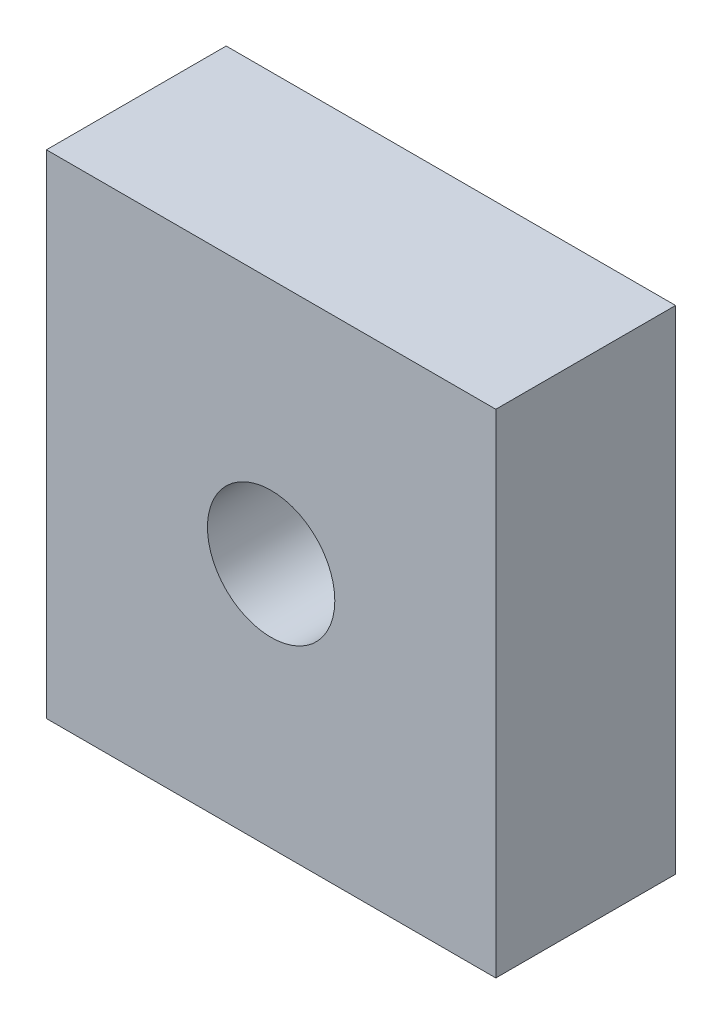
ISO-10303-21;
HEADER;
FILE_DESCRIPTION(('STEP AP214'),'2;1');
FILE_NAME('part.step','',(''),(''),'','','');
FILE_SCHEMA(('AUTOMOTIVE_DESIGN { 1 0 10303 214 1 1 1 1 }'));
ENDSEC;
DATA;
#1=APPLICATION_CONTEXT('core data for automotive mechanical design processes');
#2=APPLICATION_PROTOCOL_DEFINITION('international standard','automotive_design',2000,#1);
#3=PRODUCT_CONTEXT('',#1,'mechanical');
#4=PRODUCT('Part','Part','',(#3));
#5=PRODUCT_RELATED_PRODUCT_CATEGORY('part','',(#4));
#6=PRODUCT_DEFINITION_FORMATION('','',#4);
#7=PRODUCT_DEFINITION_CONTEXT('part definition',#1,'design');
#8=PRODUCT_DEFINITION('design','',#6,#7);
#9=PRODUCT_DEFINITION_SHAPE('','',#8);
#10=(LENGTH_UNIT() NAMED_UNIT(*) SI_UNIT(.MILLI.,.METRE.));
#11=(NAMED_UNIT(*) PLANE_ANGLE_UNIT() SI_UNIT($,.RADIAN.));
#12=(NAMED_UNIT(*) SI_UNIT($,.STERADIAN.) SOLID_ANGLE_UNIT());
#13=UNCERTAINTY_MEASURE_WITH_UNIT(LENGTH_MEASURE(1.E-05),#10,'distance_accuracy_value','');
#14=(GEOMETRIC_REPRESENTATION_CONTEXT(3) GLOBAL_UNCERTAINTY_ASSIGNED_CONTEXT((#13)) GLOBAL_UNIT_ASSIGNED_CONTEXT((#10,
#11,#12)) REPRESENTATION_CONTEXT('',''));
#15=CARTESIAN_POINT('',(0.,0.,0.));
#16=DIRECTION('',(0.,0.,1.));
#17=DIRECTION('',(1.,0.,0.));
#18=AXIS2_PLACEMENT_3D('',#15,#16,#17);
#19=CARTESIAN_POINT('',(0.,0.,6.35));
#20=DIRECTION('',(-1.,0.,0.));
#21=DIRECTION('',(0.,-1.,0.));
#22=AXIS2_PLACEMENT_3D('',#19,#20,#21);
#23=PLANE('',#22);
#24=DIRECTION('',(0.,1.,0.));
#25=VECTOR('',#24,1.);
#26=CARTESIAN_POINT('',(0.,0.,0.));
#27=LINE('',#26,#25);
#28=CARTESIAN_POINT('',(0.,0.,0.));
#29=VERTEX_POINT('',#28);
#30=CARTESIAN_POINT('',(0.,17.4,0.));
#31=VERTEX_POINT('',#30);
#32=EDGE_CURVE('E95',#29,#31,#27,.T.);
#33=ORIENTED_EDGE('',*,*,#32,.T.);
#34=DIRECTION('',(0.,0.,-1.));
#35=VECTOR('',#34,1.);
#36=CARTESIAN_POINT('',(0.,17.4,6.35));
#37=LINE('',#36,#35);
#38=CARTESIAN_POINT('',(0.,17.4,6.35));
#39=VERTEX_POINT('',#38);
#40=EDGE_CURVE('E11',#39,#31,#37,.T.);
#41=ORIENTED_EDGE('',*,*,#40,.F.);
#42=DIRECTION('',(0.,1.,0.));
#43=VECTOR('',#42,1.);
#44=CARTESIAN_POINT('',(0.,0.,6.35));
#45=LINE('',#44,#43);
#46=CARTESIAN_POINT('',(0.,0.,6.35));
#47=VERTEX_POINT('',#46);
#48=EDGE_CURVE('E83',#47,#39,#45,.T.);
#49=ORIENTED_EDGE('',*,*,#48,.F.);
#50=DIRECTION('',(0.,0.,-1.));
#51=VECTOR('',#50,1.);
#52=CARTESIAN_POINT('',(0.,0.,6.35));
#53=LINE('',#52,#51);
#54=EDGE_CURVE('E91',#47,#29,#53,.T.);
#55=ORIENTED_EDGE('',*,*,#54,.T.);
#56=EDGE_LOOP('',(#33,#41,#49,#55));
#57=FACE_BOUND('',#56,.T.);
#58=ADVANCED_FACE('F32',(#57),#23,.F.);
#59=CARTESIAN_POINT('',(0.,17.4,6.35));
#60=DIRECTION('',(0.,-1.,0.));
#61=DIRECTION('',(1.,0.,0.));
#62=AXIS2_PLACEMENT_3D('',#59,#60,#61);
#63=PLANE('',#62);
#64=DIRECTION('',(-1.,0.,0.));
#65=VECTOR('',#64,1.);
#66=CARTESIAN_POINT('',(0.,17.4,0.));
#67=LINE('',#66,#65);
#68=CARTESIAN_POINT('',(-15.875,17.4,0.));
#69=VERTEX_POINT('',#68);
#70=EDGE_CURVE('E87',#31,#69,#67,.T.);
#71=ORIENTED_EDGE('',*,*,#70,.T.);
#72=DIRECTION('',(0.,0.,-1.));
#73=VECTOR('',#72,1.);
#74=CARTESIAN_POINT('',(-15.875,17.4,6.35));
#75=LINE('',#74,#73);
#76=CARTESIAN_POINT('',(-15.875,17.4,6.35));
#77=VERTEX_POINT('',#76);
#78=EDGE_CURVE('E40',#77,#69,#75,.T.);
#79=ORIENTED_EDGE('',*,*,#78,.F.);
#80=DIRECTION('',(-1.,0.,0.));
#81=VECTOR('',#80,1.);
#82=CARTESIAN_POINT('',(0.,17.4,6.35));
#83=LINE('',#82,#81);
#84=EDGE_CURVE('E78',#39,#77,#83,.T.);
#85=ORIENTED_EDGE('',*,*,#84,.F.);
#86=ORIENTED_EDGE('',*,*,#40,.T.);
#87=EDGE_LOOP('',(#71,#79,#85,#86));
#88=FACE_BOUND('',#87,.T.);
#89=ADVANCED_FACE('F86',(#88),#63,.F.);
#90=CARTESIAN_POINT('',(-15.875,0.,6.35));
#91=DIRECTION('',(1.,0.,0.));
#92=DIRECTION('',(0.,0.,-1.));
#93=AXIS2_PLACEMENT_3D('',#90,#91,#92);
#94=PLANE('',#93);
#95=DIRECTION('',(0.,-1.,0.));
#96=VECTOR('',#95,1.);
#97=CARTESIAN_POINT('',(-15.875,0.,0.));
#98=LINE('',#97,#96);
#99=CARTESIAN_POINT('',(-15.875,0.,0.));
#100=VERTEX_POINT('',#99);
#101=EDGE_CURVE('E65',#69,#100,#98,.T.);
#102=ORIENTED_EDGE('',*,*,#101,.T.);
#103=DIRECTION('',(0.,0.,-1.));
#104=VECTOR('',#103,1.);
#105=CARTESIAN_POINT('',(-15.875,0.,6.35));
#106=LINE('',#105,#104);
#107=CARTESIAN_POINT('',(-15.875,0.,6.35));
#108=VERTEX_POINT('',#107);
#109=EDGE_CURVE('E88',#108,#100,#106,.T.);
#110=ORIENTED_EDGE('',*,*,#109,.F.);
#111=DIRECTION('',(0.,-1.,0.));
#112=VECTOR('',#111,1.);
#113=CARTESIAN_POINT('',(-15.875,0.,6.35));
#114=LINE('',#113,#112);
#115=EDGE_CURVE('E81',#77,#108,#114,.T.);
#116=ORIENTED_EDGE('',*,*,#115,.F.);
#117=ORIENTED_EDGE('',*,*,#78,.T.);
#118=EDGE_LOOP('',(#102,#110,#116,#117));
#119=FACE_BOUND('',#118,.T.);
#120=ADVANCED_FACE('F89',(#119),#94,.F.);
#121=CARTESIAN_POINT('',(0.,0.,6.35));
#122=DIRECTION('',(0.,1.,0.));
#123=DIRECTION('',(-1.,0.,0.));
#124=AXIS2_PLACEMENT_3D('',#121,#122,#123);
#125=PLANE('',#124);
#126=DIRECTION('',(1.,0.,0.));
#127=VECTOR('',#126,1.);
#128=CARTESIAN_POINT('',(0.,0.,0.));
#129=LINE('',#128,#127);
#130=EDGE_CURVE('E71',#100,#29,#129,.T.);
#131=ORIENTED_EDGE('',*,*,#130,.T.);
#132=ORIENTED_EDGE('',*,*,#54,.F.);
#133=DIRECTION('',(1.,0.,0.));
#134=VECTOR('',#133,1.);
#135=CARTESIAN_POINT('',(0.,0.,6.35));
#136=LINE('',#135,#134);
#137=EDGE_CURVE('E48',#108,#47,#136,.T.);
#138=ORIENTED_EDGE('',*,*,#137,.F.);
#139=ORIENTED_EDGE('',*,*,#109,.T.);
#140=EDGE_LOOP('',(#131,#132,#138,#139));
#141=FACE_BOUND('',#140,.T.);
#142=ADVANCED_FACE('F103',(#141),#125,.F.);
#143=CARTESIAN_POINT('',(0.,17.4,6.35));
#144=DIRECTION('',(0.,0.,1.));
#145=DIRECTION('',(1.,0.,0.));
#146=AXIS2_PLACEMENT_3D('',#143,#144,#145);
#147=PLANE('',#146);
#148=CARTESIAN_POINT('',(-7.9375,8.7,6.35));
#149=DIRECTION('',(0.,0.,1.));
#150=DIRECTION('',(1.,0.,0.));
#151=AXIS2_PLACEMENT_3D('',#148,#149,#150);
#152=CIRCLE('',#151,2.24999999999999);
#153=CARTESIAN_POINT('',(-5.68750000000001,8.7,6.35));
#154=VERTEX_POINT('',#153);
#155=EDGE_CURVE('E111',#154,#154,#152,.T.);
#156=ORIENTED_EDGE('',*,*,#155,.F.);
#157=EDGE_LOOP('',(#156));
#158=FACE_BOUND('',#157,.T.);
#159=ORIENTED_EDGE('',*,*,#48,.T.);
#160=ORIENTED_EDGE('',*,*,#84,.T.);
#161=ORIENTED_EDGE('',*,*,#115,.T.);
#162=ORIENTED_EDGE('',*,*,#137,.T.);
#163=EDGE_LOOP('',(#159,#160,#161,#162));
#164=FACE_BOUND('',#163,.T.);
#165=ADVANCED_FACE('F79',(#158,#164),#147,.T.);
#166=CARTESIAN_POINT('',(0.,17.4,0.));
#167=DIRECTION('',(0.,0.,1.));
#168=DIRECTION('',(1.,0.,0.));
#169=AXIS2_PLACEMENT_3D('',#166,#167,#168);
#170=PLANE('',#169);
#171=CARTESIAN_POINT('',(-7.9375,8.7,0.));
#172=DIRECTION('',(0.,0.,1.));
#173=DIRECTION('',(1.,0.,0.));
#174=AXIS2_PLACEMENT_3D('',#171,#172,#173);
#175=CIRCLE('',#174,2.24999999999999);
#176=CARTESIAN_POINT('',(-5.68750000000001,8.7,0.));
#177=VERTEX_POINT('',#176);
#178=EDGE_CURVE('E98',#177,#177,#175,.T.);
#179=ORIENTED_EDGE('',*,*,#178,.T.);
#180=EDGE_LOOP('',(#179));
#181=FACE_BOUND('',#180,.T.);
#182=ORIENTED_EDGE('',*,*,#32,.F.);
#183=ORIENTED_EDGE('',*,*,#130,.F.);
#184=ORIENTED_EDGE('',*,*,#101,.F.);
#185=ORIENTED_EDGE('',*,*,#70,.F.);
#186=EDGE_LOOP('',(#182,#183,#184,#185));
#187=FACE_BOUND('',#186,.T.);
#188=ADVANCED_FACE('F106',(#181,#187),#170,.F.);
#189=CARTESIAN_POINT('',(-7.9375,8.7,6.35));
#190=DIRECTION('',(0.,0.,1.));
#191=DIRECTION('',(1.,0.,0.));
#192=AXIS2_PLACEMENT_3D('',#189,#190,#191);
#193=CYLINDRICAL_SURFACE('',#192,2.24999999999999);
#194=ORIENTED_EDGE('',*,*,#155,.T.);
#195=EDGE_LOOP('',(#194));
#196=FACE_BOUND('',#195,.T.);
#197=ORIENTED_EDGE('',*,*,#178,.F.);
#198=EDGE_LOOP('',(#197));
#199=FACE_BOUND('',#198,.T.);
#200=ADVANCED_FACE('F115',(#196,#199),#193,.F.);
#201=CLOSED_SHELL('',(#58,#89,#120,#142,#165,#188,#200));
#202=MANIFOLD_SOLID_BREP('B2',#201);
#203=ADVANCED_BREP_SHAPE_REPRESENTATION('',(#18,#202),#14);
#204=SHAPE_DEFINITION_REPRESENTATION(#9,#203);
ENDSEC;
END-ISO-10303-21;
